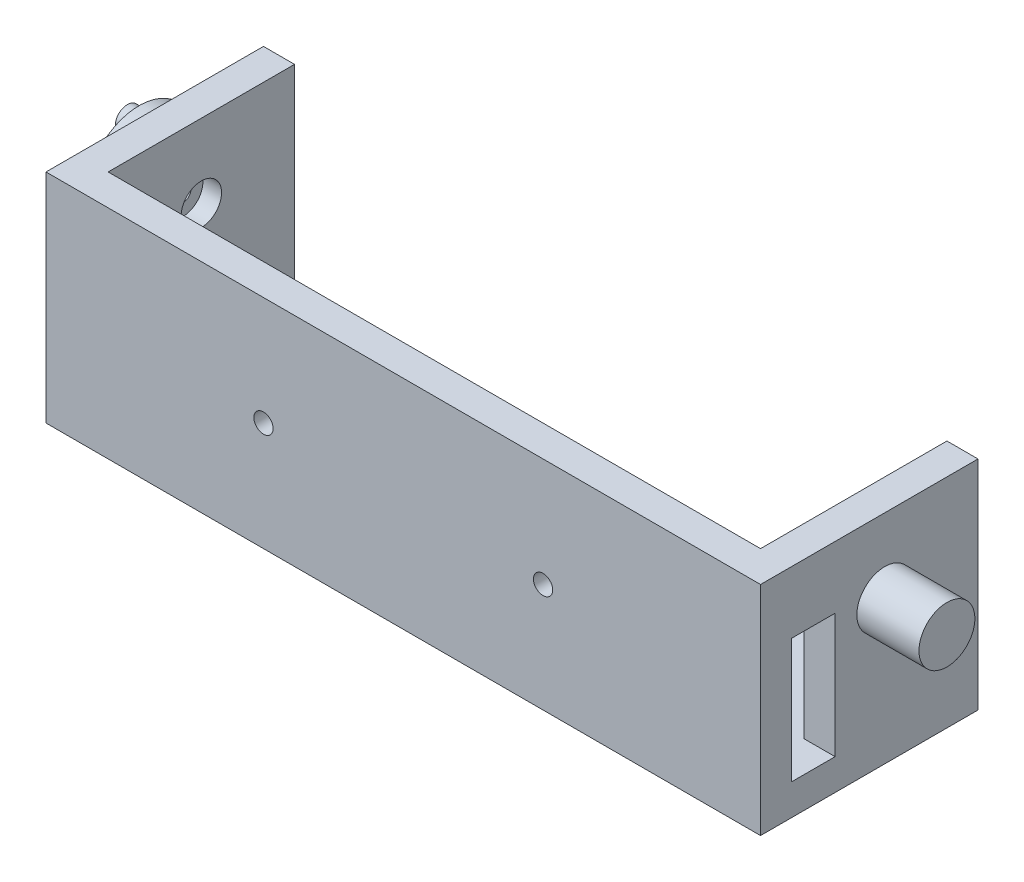
ISO-10303-21;
HEADER;
FILE_DESCRIPTION(('STEP AP214'),'2;1');
FILE_NAME('part.step','',(''),(''),'','','');
FILE_SCHEMA(('AUTOMOTIVE_DESIGN { 1 0 10303 214 1 1 1 1 }'));
ENDSEC;
DATA;
#1=APPLICATION_CONTEXT('core data for automotive mechanical design processes');
#2=APPLICATION_PROTOCOL_DEFINITION('international standard','automotive_design',2000,#1);
#3=PRODUCT_CONTEXT('',#1,'mechanical');
#4=PRODUCT('Part','Part','',(#3));
#5=PRODUCT_RELATED_PRODUCT_CATEGORY('part','',(#4));
#6=PRODUCT_DEFINITION_FORMATION('','',#4);
#7=PRODUCT_DEFINITION_CONTEXT('part definition',#1,'design');
#8=PRODUCT_DEFINITION('design','',#6,#7);
#9=PRODUCT_DEFINITION_SHAPE('','',#8);
#10=(LENGTH_UNIT() NAMED_UNIT(*) SI_UNIT(.MILLI.,.METRE.));
#11=(NAMED_UNIT(*) PLANE_ANGLE_UNIT() SI_UNIT($,.RADIAN.));
#12=(NAMED_UNIT(*) SI_UNIT($,.STERADIAN.) SOLID_ANGLE_UNIT());
#13=UNCERTAINTY_MEASURE_WITH_UNIT(LENGTH_MEASURE(1.E-05),#10,'distance_accuracy_value','');
#14=(GEOMETRIC_REPRESENTATION_CONTEXT(3) GLOBAL_UNCERTAINTY_ASSIGNED_CONTEXT((#13)) GLOBAL_UNIT_ASSIGNED_CONTEXT((#10,
#11,#12)) REPRESENTATION_CONTEXT('',''));
#15=CARTESIAN_POINT('',(0.,0.,0.));
#16=DIRECTION('',(0.,0.,1.));
#17=DIRECTION('',(1.,0.,0.));
#18=AXIS2_PLACEMENT_3D('',#15,#16,#17);
#19=CARTESIAN_POINT('',(8.81837661840736,23.,15.));
#20=DIRECTION('',(-1.,0.,0.));
#21=DIRECTION('',(0.,0.,1.));
#22=AXIS2_PLACEMENT_3D('',#19,#20,#21);
#23=CYLINDRICAL_SURFACE('',#22,1.35);
#24=CARTESIAN_POINT('',(-5.,23.,15.));
#25=DIRECTION('',(-1.,0.,0.));
#26=DIRECTION('',(0.,0.,1.));
#27=AXIS2_PLACEMENT_3D('',#24,#25,#26);
#28=CIRCLE('',#27,1.35);
#29=CARTESIAN_POINT('',(-5.,23.,16.35));
#30=VERTEX_POINT('',#29);
#31=EDGE_CURVE('E156',#30,#30,#28,.T.);
#32=ORIENTED_EDGE('',*,*,#31,.T.);
#33=EDGE_LOOP('',(#32));
#34=FACE_BOUND('',#33,.T.);
#35=CARTESIAN_POINT('',(2.,23.,15.));
#36=DIRECTION('',(1.,0.,0.));
#37=DIRECTION('',(0.,0.,-1.));
#38=AXIS2_PLACEMENT_3D('',#35,#36,#37);
#39=CIRCLE('',#38,1.35);
#40=CARTESIAN_POINT('',(2.,23.,13.65));
#41=VERTEX_POINT('',#40);
#42=EDGE_CURVE('E151',#41,#41,#39,.F.);
#43=ORIENTED_EDGE('',*,*,#42,.F.);
#44=EDGE_LOOP('',(#43));
#45=FACE_BOUND('',#44,.T.);
#46=ADVANCED_FACE('F37',(#34,#45),#23,.F.);
#47=CARTESIAN_POINT('',(0.,5.,0.));
#48=DIRECTION('',(0.,1.,0.));
#49=DIRECTION('',(0.,0.,1.));
#50=AXIS2_PLACEMENT_3D('',#47,#48,#49);
#51=PLANE('',#50);
#52=DIRECTION('',(1.,0.,0.));
#53=VECTOR('',#52,1.);
#54=CARTESIAN_POINT('',(0.,5.,30.));
#55=LINE('',#54,#53);
#56=CARTESIAN_POINT('',(5.,5.,30.));
#57=VERTEX_POINT('',#56);
#58=CARTESIAN_POINT('',(115.,5.,30.));
#59=VERTEX_POINT('',#58);
#60=EDGE_CURVE('E52',#57,#59,#55,.T.);
#61=ORIENTED_EDGE('',*,*,#60,.T.);
#62=DIRECTION('',(0.,0.,-1.));
#63=VECTOR('',#62,1.);
#64=CARTESIAN_POINT('',(115.,5.,30.));
#65=LINE('',#64,#63);
#66=CARTESIAN_POINT('',(115.,5.,23.));
#67=VERTEX_POINT('',#66);
#68=EDGE_CURVE('E132',#59,#67,#65,.T.);
#69=ORIENTED_EDGE('',*,*,#68,.T.);
#70=DIRECTION('',(1.,0.,0.));
#71=VECTOR('',#70,1.);
#72=CARTESIAN_POINT('',(88.8103798995829,5.,23.));
#73=LINE('',#72,#71);
#74=CARTESIAN_POINT('',(110.,5.,23.));
#75=VERTEX_POINT('',#74);
#76=EDGE_CURVE('E120',#75,#67,#73,.T.);
#77=ORIENTED_EDGE('',*,*,#76,.F.);
#78=DIRECTION('',(0.,0.,1.));
#79=VECTOR('',#78,1.);
#80=CARTESIAN_POINT('',(110.,5.,0.));
#81=LINE('',#80,#79);
#82=CARTESIAN_POINT('',(110.,5.,0.));
#83=VERTEX_POINT('',#82);
#84=EDGE_CURVE('E59',#83,#75,#81,.T.);
#85=ORIENTED_EDGE('',*,*,#84,.F.);
#86=DIRECTION('',(-1.,0.,0.));
#87=VECTOR('',#86,1.);
#88=CARTESIAN_POINT('',(0.,5.,0.));
#89=LINE('',#88,#87);
#90=CARTESIAN_POINT('',(5.,5.,0.));
#91=VERTEX_POINT('',#90);
#92=EDGE_CURVE('E249',#83,#91,#89,.T.);
#93=ORIENTED_EDGE('',*,*,#92,.T.);
#94=DIRECTION('',(0.,0.,-1.));
#95=VECTOR('',#94,1.);
#96=CARTESIAN_POINT('',(5.,5.,0.));
#97=LINE('',#96,#95);
#98=EDGE_CURVE('E224',#57,#91,#97,.T.);
#99=ORIENTED_EDGE('',*,*,#98,.F.);
#100=EDGE_LOOP('',(#61,#69,#77,#85,#93,#99));
#101=FACE_BOUND('',#100,.T.);
#102=ADVANCED_FACE('F133',(#101),#51,.T.);
#103=CARTESIAN_POINT('',(0.,5.,0.));
#104=DIRECTION('',(1.,0.,0.));
#105=DIRECTION('',(0.,0.,-1.));
#106=AXIS2_PLACEMENT_3D('',#103,#104,#105);
#107=PLANE('',#106);
#108=CARTESIAN_POINT('',(0.,23.,15.));
#109=DIRECTION('',(-1.,0.,0.));
#110=DIRECTION('',(0.,0.,1.));
#111=AXIS2_PLACEMENT_3D('',#108,#109,#110);
#112=CIRCLE('',#111,8.75);
#113=CARTESIAN_POINT('',(0.,23.,23.75));
#114=VERTEX_POINT('',#113);
#115=EDGE_CURVE('E45',#114,#114,#112,.T.);
#116=ORIENTED_EDGE('',*,*,#115,.F.);
#117=EDGE_LOOP('',(#116));
#118=FACE_BOUND('',#117,.T.);
#119=DIRECTION('',(0.,0.,1.));
#120=VECTOR('',#119,1.);
#121=CARTESIAN_POINT('',(0.,0.,0.));
#122=LINE('',#121,#120);
#123=CARTESIAN_POINT('',(0.,0.,0.));
#124=VERTEX_POINT('',#123);
#125=CARTESIAN_POINT('',(0.,0.,35.));
#126=VERTEX_POINT('',#125);
#127=EDGE_CURVE('E247',#124,#126,#122,.T.);
#128=ORIENTED_EDGE('',*,*,#127,.T.);
#129=DIRECTION('',(0.,-1.,0.));
#130=VECTOR('',#129,1.);
#131=CARTESIAN_POINT('',(0.,35.,35.));
#132=LINE('',#131,#130);
#133=CARTESIAN_POINT('',(0.,35.,35.));
#134=VERTEX_POINT('',#133);
#135=EDGE_CURVE('E172',#134,#126,#132,.T.);
#136=ORIENTED_EDGE('',*,*,#135,.F.);
#137=DIRECTION('',(0.,0.,1.));
#138=VECTOR('',#137,1.);
#139=CARTESIAN_POINT('',(0.,35.,0.));
#140=LINE('',#139,#138);
#141=CARTESIAN_POINT('',(0.,35.,0.));
#142=VERTEX_POINT('',#141);
#143=EDGE_CURVE('E232',#142,#134,#140,.T.);
#144=ORIENTED_EDGE('',*,*,#143,.F.);
#145=DIRECTION('',(0.,-1.,0.));
#146=VECTOR('',#145,1.);
#147=CARTESIAN_POINT('',(0.,5.,0.));
#148=LINE('',#147,#146);
#149=EDGE_CURVE('E252',#142,#124,#148,.T.);
#150=ORIENTED_EDGE('',*,*,#149,.T.);
#151=EDGE_LOOP('',(#128,#136,#144,#150));
#152=FACE_BOUND('',#151,.T.);
#153=ADVANCED_FACE('F39',(#118,#152),#107,.F.);
#154=CARTESIAN_POINT('',(115.,5.,0.));
#155=DIRECTION('',(-1.,0.,0.));
#156=DIRECTION('',(0.,0.,1.));
#157=AXIS2_PLACEMENT_3D('',#154,#155,#156);
#158=PLANE('',#157);
#159=CARTESIAN_POINT('',(115.,23.,15.));
#160=DIRECTION('',(-1.,0.,0.));
#161=DIRECTION('',(0.,0.,1.));
#162=AXIS2_PLACEMENT_3D('',#159,#160,#161);
#163=CIRCLE('',#162,4.5);
#164=CARTESIAN_POINT('',(115.,23.,19.5));
#165=VERTEX_POINT('',#164);
#166=EDGE_CURVE('E11',#165,#165,#163,.F.);
#167=ORIENTED_EDGE('',*,*,#166,.F.);
#168=EDGE_LOOP('',(#167));
#169=FACE_BOUND('',#168,.T.);
#170=ORIENTED_EDGE('',*,*,#68,.F.);
#171=DIRECTION('',(0.,-1.,0.));
#172=VECTOR('',#171,1.);
#173=CARTESIAN_POINT('',(115.,25.,30.));
#174=LINE('',#173,#172);
#175=CARTESIAN_POINT('',(115.,25.,30.));
#176=VERTEX_POINT('',#175);
#177=EDGE_CURVE('E136',#176,#59,#174,.T.);
#178=ORIENTED_EDGE('',*,*,#177,.F.);
#179=DIRECTION('',(0.,0.,1.));
#180=VECTOR('',#179,1.);
#181=CARTESIAN_POINT('',(115.,25.,30.));
#182=LINE('',#181,#180);
#183=CARTESIAN_POINT('',(115.,25.,23.));
#184=VERTEX_POINT('',#183);
#185=EDGE_CURVE('E129',#184,#176,#182,.T.);
#186=ORIENTED_EDGE('',*,*,#185,.F.);
#187=DIRECTION('',(0.,1.,0.));
#188=VECTOR('',#187,1.);
#189=CARTESIAN_POINT('',(115.,25.,23.));
#190=LINE('',#189,#188);
#191=EDGE_CURVE('E124',#67,#184,#190,.T.);
#192=ORIENTED_EDGE('',*,*,#191,.F.);
#193=EDGE_LOOP('',(#170,#178,#186,#192));
#194=FACE_BOUND('',#193,.T.);
#195=DIRECTION('',(0.,0.,-1.));
#196=VECTOR('',#195,1.);
#197=CARTESIAN_POINT('',(115.,0.,0.));
#198=LINE('',#197,#196);
#199=CARTESIAN_POINT('',(115.,0.,35.));
#200=VERTEX_POINT('',#199);
#201=CARTESIAN_POINT('',(115.,0.,0.));
#202=VERTEX_POINT('',#201);
#203=EDGE_CURVE('E254',#200,#202,#198,.T.);
#204=ORIENTED_EDGE('',*,*,#203,.T.);
#205=DIRECTION('',(0.,-1.,0.));
#206=VECTOR('',#205,1.);
#207=CARTESIAN_POINT('',(115.,5.,0.));
#208=LINE('',#207,#206);
#209=CARTESIAN_POINT('',(115.,35.,0.));
#210=VERTEX_POINT('',#209);
#211=EDGE_CURVE('E216',#210,#202,#208,.T.);
#212=ORIENTED_EDGE('',*,*,#211,.F.);
#213=DIRECTION('',(0.,0.,-1.));
#214=VECTOR('',#213,1.);
#215=CARTESIAN_POINT('',(115.,35.,0.));
#216=LINE('',#215,#214);
#217=CARTESIAN_POINT('',(115.,35.,35.));
#218=VERTEX_POINT('',#217);
#219=EDGE_CURVE('E225',#218,#210,#216,.T.);
#220=ORIENTED_EDGE('',*,*,#219,.F.);
#221=DIRECTION('',(0.,1.,0.));
#222=VECTOR('',#221,1.);
#223=CARTESIAN_POINT('',(115.,35.,35.));
#224=LINE('',#223,#222);
#225=EDGE_CURVE('E178',#200,#218,#224,.T.);
#226=ORIENTED_EDGE('',*,*,#225,.F.);
#227=EDGE_LOOP('',(#204,#212,#220,#226));
#228=FACE_BOUND('',#227,.T.);
#229=ADVANCED_FACE('F138',(#169,#194,#228),#158,.F.);
#230=CARTESIAN_POINT('',(0.,5.,0.));
#231=DIRECTION('',(0.,0.,1.));
#232=DIRECTION('',(1.,0.,0.));
#233=AXIS2_PLACEMENT_3D('',#230,#231,#232);
#234=PLANE('',#233);
#235=DIRECTION('',(-1.,0.,0.));
#236=VECTOR('',#235,1.);
#237=CARTESIAN_POINT('',(0.,0.,0.));
#238=LINE('',#237,#236);
#239=EDGE_CURVE('E250',#202,#124,#238,.T.);
#240=ORIENTED_EDGE('',*,*,#239,.T.);
#241=ORIENTED_EDGE('',*,*,#149,.F.);
#242=DIRECTION('',(-1.,0.,0.));
#243=VECTOR('',#242,1.);
#244=CARTESIAN_POINT('',(0.,35.,0.));
#245=LINE('',#244,#243);
#246=CARTESIAN_POINT('',(5.,35.,0.));
#247=VERTEX_POINT('',#246);
#248=EDGE_CURVE('E236',#247,#142,#245,.T.);
#249=ORIENTED_EDGE('',*,*,#248,.F.);
#250=DIRECTION('',(0.,-1.,0.));
#251=VECTOR('',#250,1.);
#252=CARTESIAN_POINT('',(5.,35.,0.));
#253=LINE('',#252,#251);
#254=EDGE_CURVE('E239',#247,#91,#253,.T.);
#255=ORIENTED_EDGE('',*,*,#254,.T.);
#256=ORIENTED_EDGE('',*,*,#92,.F.);
#257=DIRECTION('',(0.,-1.,0.));
#258=VECTOR('',#257,1.);
#259=CARTESIAN_POINT('',(110.,35.,0.));
#260=LINE('',#259,#258);
#261=CARTESIAN_POINT('',(110.,35.,0.));
#262=VERTEX_POINT('',#261);
#263=EDGE_CURVE('E213',#262,#83,#260,.T.);
#264=ORIENTED_EDGE('',*,*,#263,.F.);
#265=DIRECTION('',(-1.,0.,0.));
#266=VECTOR('',#265,1.);
#267=CARTESIAN_POINT('',(115.,35.,0.));
#268=LINE('',#267,#266);
#269=EDGE_CURVE('E228',#210,#262,#268,.T.);
#270=ORIENTED_EDGE('',*,*,#269,.F.);
#271=ORIENTED_EDGE('',*,*,#211,.T.);
#272=EDGE_LOOP('',(#240,#241,#249,#255,#256,#264,#270,#271));
#273=FACE_BOUND('',#272,.T.);
#274=ADVANCED_FACE('F347',(#273),#234,.F.);
#275=CARTESIAN_POINT('',(0.,0.,0.));
#276=DIRECTION('',(0.,1.,0.));
#277=DIRECTION('',(0.,0.,1.));
#278=AXIS2_PLACEMENT_3D('',#275,#276,#277);
#279=PLANE('',#278);
#280=ORIENTED_EDGE('',*,*,#127,.F.);
#281=ORIENTED_EDGE('',*,*,#239,.F.);
#282=ORIENTED_EDGE('',*,*,#203,.F.);
#283=DIRECTION('',(1.,0.,0.));
#284=VECTOR('',#283,1.);
#285=CARTESIAN_POINT('',(0.,0.,35.));
#286=LINE('',#285,#284);
#287=EDGE_CURVE('E175',#126,#200,#286,.T.);
#288=ORIENTED_EDGE('',*,*,#287,.F.);
#289=EDGE_LOOP('',(#280,#281,#282,#288));
#290=FACE_BOUND('',#289,.T.);
#291=ADVANCED_FACE('F342',(#290),#279,.F.);
#292=CARTESIAN_POINT('',(5.,35.,0.));
#293=DIRECTION('',(-1.,0.,0.));
#294=DIRECTION('',(0.,0.,1.));
#295=AXIS2_PLACEMENT_3D('',#292,#293,#294);
#296=PLANE('',#295);
#297=CARTESIAN_POINT('',(5.,23.,15.));
#298=DIRECTION('',(1.,0.,0.));
#299=DIRECTION('',(0.,0.,-1.));
#300=AXIS2_PLACEMENT_3D('',#297,#298,#299);
#301=CIRCLE('',#300,3.25);
#302=CARTESIAN_POINT('',(5.,23.,11.75));
#303=VERTEX_POINT('',#302);
#304=EDGE_CURVE('E152',#303,#303,#301,.T.);
#305=ORIENTED_EDGE('',*,*,#304,.F.);
#306=EDGE_LOOP('',(#305));
#307=FACE_BOUND('',#306,.T.);
#308=ORIENTED_EDGE('',*,*,#98,.T.);
#309=ORIENTED_EDGE('',*,*,#254,.F.);
#310=DIRECTION('',(0.,0.,-1.));
#311=VECTOR('',#310,1.);
#312=CARTESIAN_POINT('',(5.,35.,0.));
#313=LINE('',#312,#311);
#314=CARTESIAN_POINT('',(5.,35.,30.));
#315=VERTEX_POINT('',#314);
#316=EDGE_CURVE('E234',#315,#247,#313,.T.);
#317=ORIENTED_EDGE('',*,*,#316,.F.);
#318=DIRECTION('',(0.,-1.,0.));
#319=VECTOR('',#318,1.);
#320=CARTESIAN_POINT('',(5.,35.,30.));
#321=LINE('',#320,#319);
#322=EDGE_CURVE('E244',#315,#57,#321,.T.);
#323=ORIENTED_EDGE('',*,*,#322,.T.);
#324=EDGE_LOOP('',(#308,#309,#317,#323));
#325=FACE_BOUND('',#324,.T.);
#326=ADVANCED_FACE('F339',(#307,#325),#296,.F.);
#327=CARTESIAN_POINT('',(0.,35.,0.));
#328=DIRECTION('',(0.,1.,0.));
#329=DIRECTION('',(0.,0.,1.));
#330=AXIS2_PLACEMENT_3D('',#327,#328,#329);
#331=PLANE('',#330);
#332=ORIENTED_EDGE('',*,*,#143,.T.);
#333=DIRECTION('',(-1.,0.,0.));
#334=VECTOR('',#333,1.);
#335=CARTESIAN_POINT('',(0.,35.,35.));
#336=LINE('',#335,#334);
#337=EDGE_CURVE('E181',#218,#134,#336,.T.);
#338=ORIENTED_EDGE('',*,*,#337,.F.);
#339=ORIENTED_EDGE('',*,*,#219,.T.);
#340=ORIENTED_EDGE('',*,*,#269,.T.);
#341=DIRECTION('',(0.,0.,1.));
#342=VECTOR('',#341,1.);
#343=CARTESIAN_POINT('',(110.,35.,0.));
#344=LINE('',#343,#342);
#345=CARTESIAN_POINT('',(110.,35.,30.));
#346=VERTEX_POINT('',#345);
#347=EDGE_CURVE('E222',#262,#346,#344,.T.);
#348=ORIENTED_EDGE('',*,*,#347,.T.);
#349=DIRECTION('',(-1.,0.,0.));
#350=VECTOR('',#349,1.);
#351=CARTESIAN_POINT('',(0.,35.,30.));
#352=LINE('',#351,#350);
#353=EDGE_CURVE('E163',#346,#315,#352,.T.);
#354=ORIENTED_EDGE('',*,*,#353,.T.);
#355=ORIENTED_EDGE('',*,*,#316,.T.);
#356=ORIENTED_EDGE('',*,*,#248,.T.);
#357=EDGE_LOOP('',(#332,#338,#339,#340,#348,#354,#355,#356));
#358=FACE_BOUND('',#357,.T.);
#359=ADVANCED_FACE('F335',(#358),#331,.T.);
#360=CARTESIAN_POINT('',(110.,35.,0.));
#361=DIRECTION('',(1.,0.,0.));
#362=DIRECTION('',(0.,0.,-1.));
#363=AXIS2_PLACEMENT_3D('',#360,#361,#362);
#364=PLANE('',#363);
#365=DIRECTION('',(0.,-1.,0.));
#366=VECTOR('',#365,1.);
#367=CARTESIAN_POINT('',(110.,25.,23.));
#368=LINE('',#367,#366);
#369=CARTESIAN_POINT('',(110.,25.,23.));
#370=VERTEX_POINT('',#369);
#371=EDGE_CURVE('E127',#370,#75,#368,.T.);
#372=ORIENTED_EDGE('',*,*,#371,.F.);
#373=DIRECTION('',(0.,0.,-1.));
#374=VECTOR('',#373,1.);
#375=CARTESIAN_POINT('',(110.,25.,30.));
#376=LINE('',#375,#374);
#377=CARTESIAN_POINT('',(110.,25.,30.));
#378=VERTEX_POINT('',#377);
#379=EDGE_CURVE('E155',#378,#370,#376,.T.);
#380=ORIENTED_EDGE('',*,*,#379,.F.);
#381=DIRECTION('',(0.,-1.,0.));
#382=VECTOR('',#381,1.);
#383=CARTESIAN_POINT('',(110.,35.,30.));
#384=LINE('',#383,#382);
#385=EDGE_CURVE('E219',#346,#378,#384,.T.);
#386=ORIENTED_EDGE('',*,*,#385,.F.);
#387=ORIENTED_EDGE('',*,*,#347,.F.);
#388=ORIENTED_EDGE('',*,*,#263,.T.);
#389=ORIENTED_EDGE('',*,*,#84,.T.);
#390=EDGE_LOOP('',(#372,#380,#386,#387,#388,#389));
#391=FACE_BOUND('',#390,.T.);
#392=ADVANCED_FACE('F331',(#391),#364,.F.);
#393=CARTESIAN_POINT('',(-5.,23.,15.));
#394=DIRECTION('',(1.,0.,0.));
#395=DIRECTION('',(0.,0.,-1.));
#396=AXIS2_PLACEMENT_3D('',#393,#394,#395);
#397=CYLINDRICAL_SURFACE('',#396,8.75);
#398=CARTESIAN_POINT('',(-5.,23.,15.));
#399=DIRECTION('',(-1.,0.,0.));
#400=DIRECTION('',(0.,0.,1.));
#401=AXIS2_PLACEMENT_3D('',#398,#399,#400);
#402=CIRCLE('',#401,8.75);
#403=CARTESIAN_POINT('',(-5.,23.,23.75));
#404=VERTEX_POINT('',#403);
#405=EDGE_CURVE('E208',#404,#404,#402,.T.);
#406=ORIENTED_EDGE('',*,*,#405,.F.);
#407=EDGE_LOOP('',(#406));
#408=FACE_BOUND('',#407,.T.);
#409=ORIENTED_EDGE('',*,*,#115,.T.);
#410=EDGE_LOOP('',(#409));
#411=FACE_BOUND('',#410,.T.);
#412=ADVANCED_FACE('F327',(#408,#411),#397,.T.);
#413=CARTESIAN_POINT('',(-5.,23.,15.));
#414=DIRECTION('',(-1.,0.,0.));
#415=DIRECTION('',(0.,0.,1.));
#416=AXIS2_PLACEMENT_3D('',#413,#414,#415);
#417=PLANE('',#416);
#418=ORIENTED_EDGE('',*,*,#31,.F.);
#419=EDGE_LOOP('',(#418));
#420=FACE_BOUND('',#419,.T.);
#421=CARTESIAN_POINT('',(-5.,23.0000000000001,21.));
#422=DIRECTION('',(-1.,0.,0.));
#423=DIRECTION('',(0.,-1.,0.));
#424=AXIS2_PLACEMENT_3D('',#421,#422,#423);
#425=CIRCLE('',#424,1.95);
#426=CARTESIAN_POINT('',(-5.,23.0000000000001,19.05));
#427=VERTEX_POINT('',#426);
#428=EDGE_CURVE('E184',#427,#427,#425,.T.);
#429=ORIENTED_EDGE('',*,*,#428,.F.);
#430=EDGE_LOOP('',(#429));
#431=FACE_BOUND('',#430,.T.);
#432=CARTESIAN_POINT('',(-5.,17.,15.));
#433=DIRECTION('',(-1.,0.,0.));
#434=DIRECTION('',(0.,0.,-1.));
#435=AXIS2_PLACEMENT_3D('',#432,#433,#434);
#436=CIRCLE('',#435,1.95);
#437=CARTESIAN_POINT('',(-5.,17.,13.05));
#438=VERTEX_POINT('',#437);
#439=EDGE_CURVE('E190',#438,#438,#436,.T.);
#440=ORIENTED_EDGE('',*,*,#439,.F.);
#441=EDGE_LOOP('',(#440));
#442=FACE_BOUND('',#441,.T.);
#443=CARTESIAN_POINT('',(-5.,23.,9.));
#444=DIRECTION('',(-1.,0.,0.));
#445=DIRECTION('',(0.,1.,0.));
#446=AXIS2_PLACEMENT_3D('',#443,#444,#445);
#447=CIRCLE('',#446,1.95);
#448=CARTESIAN_POINT('',(-5.,23.,7.05));
#449=VERTEX_POINT('',#448);
#450=EDGE_CURVE('E196',#449,#449,#447,.T.);
#451=ORIENTED_EDGE('',*,*,#450,.F.);
#452=EDGE_LOOP('',(#451));
#453=FACE_BOUND('',#452,.T.);
#454=CARTESIAN_POINT('',(-5.,29.,15.));
#455=DIRECTION('',(-1.,0.,0.));
#456=DIRECTION('',(0.,0.,1.));
#457=AXIS2_PLACEMENT_3D('',#454,#455,#456);
#458=CIRCLE('',#457,1.95);
#459=CARTESIAN_POINT('',(-5.,29.,13.05));
#460=VERTEX_POINT('',#459);
#461=EDGE_CURVE('E202',#460,#460,#458,.T.);
#462=ORIENTED_EDGE('',*,*,#461,.F.);
#463=EDGE_LOOP('',(#462));
#464=FACE_BOUND('',#463,.T.);
#465=ORIENTED_EDGE('',*,*,#405,.T.);
#466=EDGE_LOOP('',(#465));
#467=FACE_BOUND('',#466,.T.);
#468=ADVANCED_FACE('F323',(#420,#431,#442,#453,#464,#467),#417,.T.);
#469=CARTESIAN_POINT('',(-6.9,29.,15.));
#470=DIRECTION('',(1.,0.,0.));
#471=DIRECTION('',(0.,0.,-1.));
#472=AXIS2_PLACEMENT_3D('',#469,#470,#471);
#473=CYLINDRICAL_SURFACE('',#472,1.95);
#474=CARTESIAN_POINT('',(-6.9,29.,15.));
#475=DIRECTION('',(-1.,0.,0.));
#476=DIRECTION('',(0.,0.,1.));
#477=AXIS2_PLACEMENT_3D('',#474,#475,#476);
#478=CIRCLE('',#477,1.95);
#479=CARTESIAN_POINT('',(-6.9,29.,13.05));
#480=VERTEX_POINT('',#479);
#481=EDGE_CURVE('E205',#480,#480,#478,.T.);
#482=CARTESIAN_POINT('',(-6.9,29.,13.05));
#483=CARTESIAN_POINT('',(-6.88020833333333,29.,13.05));
#484=CARTESIAN_POINT('',(-6.86041666666666,29.,13.05));
#485=CARTESIAN_POINT('',(-6.82083333333333,29.,13.05));
#486=CARTESIAN_POINT('',(-6.80104166666667,29.,13.05));
#487=CARTESIAN_POINT('',(-6.76145833333333,29.,13.05));
#488=CARTESIAN_POINT('',(-6.74166666666666,29.,13.05));
#489=CARTESIAN_POINT('',(-6.70208333333333,29.,13.05));
#490=CARTESIAN_POINT('',(-6.68229166666667,29.,13.05));
#491=CARTESIAN_POINT('',(-6.64270833333333,29.,13.05));
#492=CARTESIAN_POINT('',(-6.62291666666667,29.,13.05));
#493=CARTESIAN_POINT('',(-6.58333333333333,29.,13.05));
#494=CARTESIAN_POINT('',(-6.56354166666667,29.,13.05));
#495=CARTESIAN_POINT('',(-6.52395833333333,29.,13.05));
#496=CARTESIAN_POINT('',(-6.50416666666666,29.,13.05));
#497=CARTESIAN_POINT('',(-6.46458333333333,29.,13.05));
#498=CARTESIAN_POINT('',(-6.44479166666667,29.,13.05));
#499=CARTESIAN_POINT('',(-6.40520833333333,29.,13.05));
#500=CARTESIAN_POINT('',(-6.38541666666667,29.,13.05));
#501=CARTESIAN_POINT('',(-6.34583333333333,29.,13.05));
#502=CARTESIAN_POINT('',(-6.32604166666667,29.,13.05));
#503=CARTESIAN_POINT('',(-6.28645833333333,29.,13.05));
#504=CARTESIAN_POINT('',(-6.26666666666666,29.,13.05));
#505=CARTESIAN_POINT('',(-6.22708333333333,29.,13.05));
#506=CARTESIAN_POINT('',(-6.20729166666667,29.,13.05));
#507=CARTESIAN_POINT('',(-6.16770833333333,29.,13.05));
#508=CARTESIAN_POINT('',(-6.14791666666667,29.,13.05));
#509=CARTESIAN_POINT('',(-6.10833333333333,29.,13.05));
#510=CARTESIAN_POINT('',(-6.08854166666667,29.,13.05));
#511=CARTESIAN_POINT('',(-6.04895833333333,29.,13.05));
#512=CARTESIAN_POINT('',(-6.02916666666667,29.,13.05));
#513=CARTESIAN_POINT('',(-5.98958333333333,29.,13.05));
#514=CARTESIAN_POINT('',(-5.96979166666666,29.,13.05));
#515=CARTESIAN_POINT('',(-5.93020833333333,29.,13.05));
#516=CARTESIAN_POINT('',(-5.91041666666667,29.,13.05));
#517=CARTESIAN_POINT('',(-5.87083333333333,29.,13.05));
#518=CARTESIAN_POINT('',(-5.85104166666667,29.,13.05));
#519=CARTESIAN_POINT('',(-5.81145833333333,29.,13.05));
#520=CARTESIAN_POINT('',(-5.79166666666667,29.,13.05));
#521=CARTESIAN_POINT('',(-5.75208333333333,29.,13.05));
#522=CARTESIAN_POINT('',(-5.73229166666667,29.,13.05));
#523=CARTESIAN_POINT('',(-5.69270833333333,29.,13.05));
#524=CARTESIAN_POINT('',(-5.67291666666667,29.,13.05));
#525=CARTESIAN_POINT('',(-5.63333333333333,29.,13.05));
#526=CARTESIAN_POINT('',(-5.61354166666667,29.,13.05));
#527=CARTESIAN_POINT('',(-5.57395833333333,29.,13.05));
#528=CARTESIAN_POINT('',(-5.55416666666667,29.,13.05));
#529=CARTESIAN_POINT('',(-5.51458333333333,29.,13.05));
#530=CARTESIAN_POINT('',(-5.49479166666667,29.,13.05));
#531=CARTESIAN_POINT('',(-5.45520833333333,29.,13.05));
#532=CARTESIAN_POINT('',(-5.43541666666667,29.,13.05));
#533=CARTESIAN_POINT('',(-5.39583333333333,29.,13.05));
#534=CARTESIAN_POINT('',(-5.37604166666666,29.,13.05));
#535=CARTESIAN_POINT('',(-5.33645833333333,29.,13.05));
#536=CARTESIAN_POINT('',(-5.31666666666666,29.,13.05));
#537=CARTESIAN_POINT('',(-5.27708333333333,29.,13.05));
#538=CARTESIAN_POINT('',(-5.25729166666667,29.,13.05));
#539=CARTESIAN_POINT('',(-5.21770833333333,29.,13.05));
#540=CARTESIAN_POINT('',(-5.19791666666667,29.,13.05));
#541=CARTESIAN_POINT('',(-5.15833333333333,29.,13.05));
#542=CARTESIAN_POINT('',(-5.13854166666667,29.,13.05));
#543=CARTESIAN_POINT('',(-5.09895833333333,29.,13.05));
#544=CARTESIAN_POINT('',(-5.07916666666666,29.,13.05));
#545=CARTESIAN_POINT('',(-5.03958333333333,29.,13.05));
#546=CARTESIAN_POINT('',(-5.01979166666667,29.,13.05));
#547=CARTESIAN_POINT('',(-5.,29.,13.05));
#548=B_SPLINE_CURVE_WITH_KNOTS('',3,(#482,#483,#484,#485,#486,#487,#488,#489,#490,#491,#492,
#493,#494,#495,#496,#497,#498,#499,#500,#501,#502,#503,#504,#505,#506,#507,#508,#509,#510,#511,
#512,#513,#514,#515,#516,#517,#518,#519,#520,#521,#522,#523,#524,#525,#526,#527,#528,#529,#530,
#531,#532,#533,#534,#535,#536,#537,#538,#539,#540,#541,#542,#543,#544,#545,#546,#547),
.UNSPECIFIED.,.F.,.F.,(4,2,2,2,2,2,2,2,2,2,2,2,2,2,2,2,2,2,2,2,2,2,2,2,2,2,2,2,2,2,2,2,4),(0.,
0.0593749999999995,0.11875,0.178124999999999,0.2375,0.296874999999999,0.35625,0.415624999999999,
0.475,0.534374999999999,0.59375,0.653124999999999,0.7125,0.771875,0.831249999999999,0.890625,
0.95,1.009375,1.06875,1.128125,1.1875,1.246875,1.30625,1.365625,1.425,1.484375,1.54375,1.603125,
1.6625,1.721875,1.78125,1.840625,1.9),.UNSPECIFIED.);
#549=EDGE_CURVE('BSEAM319',#480,#460,#548,.T.);
#550=ORIENTED_EDGE('',*,*,#481,.F.);
#551=ORIENTED_EDGE('',*,*,#461,.T.);
#552=ORIENTED_EDGE('',*,*,#549,.T.);
#553=ORIENTED_EDGE('',*,*,#549,.F.);
#554=EDGE_LOOP('',(#550,#552,#551,#553));
#555=FACE_BOUND('',#554,.T.);
#556=ADVANCED_FACE('F319',(#555),#473,.T.);
#557=CARTESIAN_POINT('',(-6.9,29.,15.));
#558=DIRECTION('',(-1.,0.,0.));
#559=DIRECTION('',(0.,0.,1.));
#560=AXIS2_PLACEMENT_3D('',#557,#558,#559);
#561=PLANE('',#560);
#562=ORIENTED_EDGE('',*,*,#481,.T.);
#563=EDGE_LOOP('',(#562));
#564=FACE_BOUND('',#563,.T.);
#565=ADVANCED_FACE('F315',(#564),#561,.T.);
#566=CARTESIAN_POINT('',(-6.9,23.,9.));
#567=DIRECTION('',(1.,0.,0.));
#568=DIRECTION('',(0.,0.,-1.));
#569=AXIS2_PLACEMENT_3D('',#566,#567,#568);
#570=CYLINDRICAL_SURFACE('',#569,1.95);
#571=CARTESIAN_POINT('',(-6.9,23.,9.));
#572=DIRECTION('',(-1.,0.,0.));
#573=DIRECTION('',(0.,1.,0.));
#574=AXIS2_PLACEMENT_3D('',#571,#572,#573);
#575=CIRCLE('',#574,1.95);
#576=CARTESIAN_POINT('',(-6.9,23.,7.05));
#577=VERTEX_POINT('',#576);
#578=EDGE_CURVE('E199',#577,#577,#575,.T.);
#579=CARTESIAN_POINT('',(-6.9,23.,7.05));
#580=CARTESIAN_POINT('',(-6.88020833333333,23.,7.05));
#581=CARTESIAN_POINT('',(-6.86041666666667,23.,7.05));
#582=CARTESIAN_POINT('',(-6.82083333333333,23.,7.05));
#583=CARTESIAN_POINT('',(-6.80104166666667,23.,7.05));
#584=CARTESIAN_POINT('',(-6.76145833333333,23.,7.05));
#585=CARTESIAN_POINT('',(-6.74166666666667,23.,7.05));
#586=CARTESIAN_POINT('',(-6.70208333333333,23.,7.05));
#587=CARTESIAN_POINT('',(-6.68229166666667,23.,7.05));
#588=CARTESIAN_POINT('',(-6.64270833333333,23.,7.05));
#589=CARTESIAN_POINT('',(-6.62291666666667,23.,7.05));
#590=CARTESIAN_POINT('',(-6.58333333333333,23.,7.05));
#591=CARTESIAN_POINT('',(-6.56354166666667,23.,7.05));
#592=CARTESIAN_POINT('',(-6.52395833333333,23.,7.05));
#593=CARTESIAN_POINT('',(-6.50416666666667,23.,7.05));
#594=CARTESIAN_POINT('',(-6.46458333333333,23.,7.05));
#595=CARTESIAN_POINT('',(-6.44479166666667,23.,7.05));
#596=CARTESIAN_POINT('',(-6.40520833333333,23.,7.05));
#597=CARTESIAN_POINT('',(-6.38541666666667,23.,7.05));
#598=CARTESIAN_POINT('',(-6.34583333333333,23.,7.05));
#599=CARTESIAN_POINT('',(-6.32604166666667,23.,7.05));
#600=CARTESIAN_POINT('',(-6.28645833333333,23.,7.05));
#601=CARTESIAN_POINT('',(-6.26666666666667,23.,7.05));
#602=CARTESIAN_POINT('',(-6.22708333333333,23.,7.05));
#603=CARTESIAN_POINT('',(-6.20729166666667,23.,7.05));
#604=CARTESIAN_POINT('',(-6.16770833333333,23.,7.05));
#605=CARTESIAN_POINT('',(-6.14791666666667,23.,7.05));
#606=CARTESIAN_POINT('',(-6.10833333333333,23.,7.05));
#607=CARTESIAN_POINT('',(-6.08854166666667,23.,7.05));
#608=CARTESIAN_POINT('',(-6.04895833333333,23.,7.05));
#609=CARTESIAN_POINT('',(-6.02916666666667,23.,7.05));
#610=CARTESIAN_POINT('',(-5.98958333333333,23.,7.05));
#611=CARTESIAN_POINT('',(-5.96979166666667,23.,7.05));
#612=CARTESIAN_POINT('',(-5.93020833333333,23.,7.05));
#613=CARTESIAN_POINT('',(-5.91041666666667,23.,7.05));
#614=CARTESIAN_POINT('',(-5.87083333333333,23.,7.05));
#615=CARTESIAN_POINT('',(-5.85104166666667,23.,7.05));
#616=CARTESIAN_POINT('',(-5.81145833333333,23.,7.05));
#617=CARTESIAN_POINT('',(-5.79166666666667,23.,7.05));
#618=CARTESIAN_POINT('',(-5.75208333333333,23.,7.05));
#619=CARTESIAN_POINT('',(-5.73229166666667,23.,7.05));
#620=CARTESIAN_POINT('',(-5.69270833333333,23.,7.05));
#621=CARTESIAN_POINT('',(-5.67291666666667,23.,7.05));
#622=CARTESIAN_POINT('',(-5.63333333333333,23.,7.05));
#623=CARTESIAN_POINT('',(-5.61354166666667,23.,7.05));
#624=CARTESIAN_POINT('',(-5.57395833333333,23.,7.05));
#625=CARTESIAN_POINT('',(-5.55416666666667,23.,7.05));
#626=CARTESIAN_POINT('',(-5.51458333333333,23.,7.05));
#627=CARTESIAN_POINT('',(-5.49479166666667,23.,7.05));
#628=CARTESIAN_POINT('',(-5.45520833333333,23.,7.05));
#629=CARTESIAN_POINT('',(-5.43541666666667,23.,7.05));
#630=CARTESIAN_POINT('',(-5.39583333333333,23.,7.05));
#631=CARTESIAN_POINT('',(-5.37604166666667,23.,7.05));
#632=CARTESIAN_POINT('',(-5.33645833333333,23.,7.05));
#633=CARTESIAN_POINT('',(-5.31666666666667,23.,7.05));
#634=CARTESIAN_POINT('',(-5.27708333333333,23.,7.05));
#635=CARTESIAN_POINT('',(-5.25729166666667,23.,7.05));
#636=CARTESIAN_POINT('',(-5.21770833333333,23.,7.05));
#637=CARTESIAN_POINT('',(-5.19791666666667,23.,7.05));
#638=CARTESIAN_POINT('',(-5.15833333333333,23.,7.05));
#639=CARTESIAN_POINT('',(-5.13854166666667,23.,7.05));
#640=CARTESIAN_POINT('',(-5.09895833333333,23.,7.05));
#641=CARTESIAN_POINT('',(-5.07916666666667,23.,7.05));
#642=CARTESIAN_POINT('',(-5.03958333333333,23.,7.05));
#643=CARTESIAN_POINT('',(-5.01979166666667,23.,7.05));
#644=CARTESIAN_POINT('',(-5.,23.,7.05));
#645=B_SPLINE_CURVE_WITH_KNOTS('',3,(#579,#580,#581,#582,#583,#584,#585,#586,#587,#588,#589,
#590,#591,#592,#593,#594,#595,#596,#597,#598,#599,#600,#601,#602,#603,#604,#605,#606,#607,#608,
#609,#610,#611,#612,#613,#614,#615,#616,#617,#618,#619,#620,#621,#622,#623,#624,#625,#626,#627,
#628,#629,#630,#631,#632,#633,#634,#635,#636,#637,#638,#639,#640,#641,#642,#643,#644),
.UNSPECIFIED.,.F.,.F.,(4,2,2,2,2,2,2,2,2,2,2,2,2,2,2,2,2,2,2,2,2,2,2,2,2,2,2,2,2,2,2,2,4),(0.,
0.0593749999999995,0.11875,0.178124999999999,0.2375,0.296874999999999,0.35625,0.415624999999999,
0.475,0.534374999999999,0.59375,0.653124999999999,0.7125,0.771874999999999,0.831249999999999,
0.890624999999999,0.95,1.009375,1.06875,1.128125,1.1875,1.246875,1.30625,1.365625,1.425,
1.484375,1.54375,1.603125,1.6625,1.721875,1.78125,1.840625,1.9),.UNSPECIFIED.);
#646=EDGE_CURVE('BSEAM311',#577,#449,#645,.T.);
#647=ORIENTED_EDGE('',*,*,#578,.F.);
#648=ORIENTED_EDGE('',*,*,#450,.T.);
#649=ORIENTED_EDGE('',*,*,#646,.T.);
#650=ORIENTED_EDGE('',*,*,#646,.F.);
#651=EDGE_LOOP('',(#647,#649,#648,#650));
#652=FACE_BOUND('',#651,.T.);
#653=ADVANCED_FACE('F311',(#652),#570,.T.);
#654=CARTESIAN_POINT('',(-6.9,23.,9.));
#655=DIRECTION('',(-1.,0.,0.));
#656=DIRECTION('',(0.,1.,0.));
#657=AXIS2_PLACEMENT_3D('',#654,#655,#656);
#658=PLANE('',#657);
#659=ORIENTED_EDGE('',*,*,#578,.T.);
#660=EDGE_LOOP('',(#659));
#661=FACE_BOUND('',#660,.T.);
#662=ADVANCED_FACE('F307',(#661),#658,.T.);
#663=CARTESIAN_POINT('',(-6.9,17.,15.));
#664=DIRECTION('',(1.,0.,0.));
#665=DIRECTION('',(0.,0.,-1.));
#666=AXIS2_PLACEMENT_3D('',#663,#664,#665);
#667=CYLINDRICAL_SURFACE('',#666,1.95);
#668=CARTESIAN_POINT('',(-6.9,17.,15.));
#669=DIRECTION('',(-1.,0.,0.));
#670=DIRECTION('',(0.,0.,-1.));
#671=AXIS2_PLACEMENT_3D('',#668,#669,#670);
#672=CIRCLE('',#671,1.95);
#673=CARTESIAN_POINT('',(-6.9,17.,13.05));
#674=VERTEX_POINT('',#673);
#675=EDGE_CURVE('E193',#674,#674,#672,.T.);
#676=CARTESIAN_POINT('',(-6.9,17.,13.05));
#677=CARTESIAN_POINT('',(-6.88020833333333,17.,13.05));
#678=CARTESIAN_POINT('',(-6.86041666666666,17.,13.05));
#679=CARTESIAN_POINT('',(-6.82083333333333,17.,13.05));
#680=CARTESIAN_POINT('',(-6.80104166666667,17.,13.05));
#681=CARTESIAN_POINT('',(-6.76145833333333,17.,13.05));
#682=CARTESIAN_POINT('',(-6.74166666666666,17.,13.05));
#683=CARTESIAN_POINT('',(-6.70208333333333,17.,13.05));
#684=CARTESIAN_POINT('',(-6.68229166666667,17.,13.05));
#685=CARTESIAN_POINT('',(-6.64270833333333,17.,13.05));
#686=CARTESIAN_POINT('',(-6.62291666666667,17.,13.05));
#687=CARTESIAN_POINT('',(-6.58333333333333,17.,13.05));
#688=CARTESIAN_POINT('',(-6.56354166666667,17.,13.05));
#689=CARTESIAN_POINT('',(-6.52395833333333,17.,13.05));
#690=CARTESIAN_POINT('',(-6.50416666666666,17.,13.05));
#691=CARTESIAN_POINT('',(-6.46458333333333,17.,13.05));
#692=CARTESIAN_POINT('',(-6.44479166666667,17.,13.05));
#693=CARTESIAN_POINT('',(-6.40520833333333,17.,13.05));
#694=CARTESIAN_POINT('',(-6.38541666666667,17.,13.05));
#695=CARTESIAN_POINT('',(-6.34583333333333,17.,13.05));
#696=CARTESIAN_POINT('',(-6.32604166666667,17.,13.05));
#697=CARTESIAN_POINT('',(-6.28645833333333,17.,13.05));
#698=CARTESIAN_POINT('',(-6.26666666666666,17.,13.05));
#699=CARTESIAN_POINT('',(-6.22708333333333,17.,13.05));
#700=CARTESIAN_POINT('',(-6.20729166666667,17.,13.05));
#701=CARTESIAN_POINT('',(-6.16770833333333,17.,13.05));
#702=CARTESIAN_POINT('',(-6.14791666666667,17.,13.05));
#703=CARTESIAN_POINT('',(-6.10833333333333,17.,13.05));
#704=CARTESIAN_POINT('',(-6.08854166666667,17.,13.05));
#705=CARTESIAN_POINT('',(-6.04895833333333,17.,13.05));
#706=CARTESIAN_POINT('',(-6.02916666666667,17.,13.05));
#707=CARTESIAN_POINT('',(-5.98958333333333,17.,13.05));
#708=CARTESIAN_POINT('',(-5.96979166666666,17.,13.05));
#709=CARTESIAN_POINT('',(-5.93020833333333,17.,13.05));
#710=CARTESIAN_POINT('',(-5.91041666666667,17.,13.05));
#711=CARTESIAN_POINT('',(-5.87083333333333,17.,13.05));
#712=CARTESIAN_POINT('',(-5.85104166666667,17.,13.05));
#713=CARTESIAN_POINT('',(-5.81145833333333,17.,13.05));
#714=CARTESIAN_POINT('',(-5.79166666666667,17.,13.05));
#715=CARTESIAN_POINT('',(-5.75208333333333,17.,13.05));
#716=CARTESIAN_POINT('',(-5.73229166666667,17.,13.05));
#717=CARTESIAN_POINT('',(-5.69270833333333,17.,13.05));
#718=CARTESIAN_POINT('',(-5.67291666666667,17.,13.05));
#719=CARTESIAN_POINT('',(-5.63333333333333,17.,13.05));
#720=CARTESIAN_POINT('',(-5.61354166666667,17.,13.05));
#721=CARTESIAN_POINT('',(-5.57395833333333,17.,13.05));
#722=CARTESIAN_POINT('',(-5.55416666666667,17.,13.05));
#723=CARTESIAN_POINT('',(-5.51458333333333,17.,13.05));
#724=CARTESIAN_POINT('',(-5.49479166666667,17.,13.05));
#725=CARTESIAN_POINT('',(-5.45520833333333,17.,13.05));
#726=CARTESIAN_POINT('',(-5.43541666666667,17.,13.05));
#727=CARTESIAN_POINT('',(-5.39583333333333,17.,13.05));
#728=CARTESIAN_POINT('',(-5.37604166666666,17.,13.05));
#729=CARTESIAN_POINT('',(-5.33645833333333,17.,13.05));
#730=CARTESIAN_POINT('',(-5.31666666666666,17.,13.05));
#731=CARTESIAN_POINT('',(-5.27708333333333,17.,13.05));
#732=CARTESIAN_POINT('',(-5.25729166666667,17.,13.05));
#733=CARTESIAN_POINT('',(-5.21770833333333,17.,13.05));
#734=CARTESIAN_POINT('',(-5.19791666666667,17.,13.05));
#735=CARTESIAN_POINT('',(-5.15833333333333,17.,13.05));
#736=CARTESIAN_POINT('',(-5.13854166666667,17.,13.05));
#737=CARTESIAN_POINT('',(-5.09895833333333,17.,13.05));
#738=CARTESIAN_POINT('',(-5.07916666666666,17.,13.05));
#739=CARTESIAN_POINT('',(-5.03958333333333,17.,13.05));
#740=CARTESIAN_POINT('',(-5.01979166666667,17.,13.05));
#741=CARTESIAN_POINT('',(-5.,17.,13.05));
#742=B_SPLINE_CURVE_WITH_KNOTS('',3,(#676,#677,#678,#679,#680,#681,#682,#683,#684,#685,#686,
#687,#688,#689,#690,#691,#692,#693,#694,#695,#696,#697,#698,#699,#700,#701,#702,#703,#704,#705,
#706,#707,#708,#709,#710,#711,#712,#713,#714,#715,#716,#717,#718,#719,#720,#721,#722,#723,#724,
#725,#726,#727,#728,#729,#730,#731,#732,#733,#734,#735,#736,#737,#738,#739,#740,#741),
.UNSPECIFIED.,.F.,.F.,(4,2,2,2,2,2,2,2,2,2,2,2,2,2,2,2,2,2,2,2,2,2,2,2,2,2,2,2,2,2,2,2,4),(0.,
0.0593749999999995,0.11875,0.178124999999999,0.2375,0.296874999999999,0.35625,0.415624999999999,
0.475,0.534374999999999,0.59375,0.653124999999999,0.7125,0.771875,0.831249999999999,0.890625,
0.95,1.009375,1.06875,1.128125,1.1875,1.246875,1.30625,1.365625,1.425,1.484375,1.54375,1.603125,
1.6625,1.721875,1.78125,1.840625,1.9),.UNSPECIFIED.);
#743=EDGE_CURVE('BSEAM303',#674,#438,#742,.T.);
#744=ORIENTED_EDGE('',*,*,#675,.F.);
#745=ORIENTED_EDGE('',*,*,#439,.T.);
#746=ORIENTED_EDGE('',*,*,#743,.T.);
#747=ORIENTED_EDGE('',*,*,#743,.F.);
#748=EDGE_LOOP('',(#744,#746,#745,#747));
#749=FACE_BOUND('',#748,.T.);
#750=ADVANCED_FACE('F303',(#749),#667,.T.);
#751=CARTESIAN_POINT('',(-6.9,17.,15.));
#752=DIRECTION('',(-1.,0.,0.));
#753=DIRECTION('',(0.,0.,-1.));
#754=AXIS2_PLACEMENT_3D('',#751,#752,#753);
#755=PLANE('',#754);
#756=ORIENTED_EDGE('',*,*,#675,.T.);
#757=EDGE_LOOP('',(#756));
#758=FACE_BOUND('',#757,.T.);
#759=ADVANCED_FACE('F299',(#758),#755,.T.);
#760=CARTESIAN_POINT('',(-6.9,23.0000000000001,21.));
#761=DIRECTION('',(1.,0.,0.));
#762=DIRECTION('',(0.,0.,-1.));
#763=AXIS2_PLACEMENT_3D('',#760,#761,#762);
#764=CYLINDRICAL_SURFACE('',#763,1.95);
#765=CARTESIAN_POINT('',(-6.9,23.0000000000001,21.));
#766=DIRECTION('',(-1.,0.,0.));
#767=DIRECTION('',(0.,-1.,0.));
#768=AXIS2_PLACEMENT_3D('',#765,#766,#767);
#769=CIRCLE('',#768,1.95);
#770=CARTESIAN_POINT('',(-6.9,23.0000000000001,19.05));
#771=VERTEX_POINT('',#770);
#772=EDGE_CURVE('E187',#771,#771,#769,.T.);
#773=CARTESIAN_POINT('',(-6.9,23.0000000000001,19.05));
#774=CARTESIAN_POINT('',(-6.88020833333333,23.0000000000001,19.05));
#775=CARTESIAN_POINT('',(-6.86041666666666,23.0000000000001,19.05));
#776=CARTESIAN_POINT('',(-6.82083333333333,23.0000000000001,19.05));
#777=CARTESIAN_POINT('',(-6.80104166666666,23.0000000000001,19.05));
#778=CARTESIAN_POINT('',(-6.76145833333333,23.0000000000001,19.05));
#779=CARTESIAN_POINT('',(-6.74166666666666,23.0000000000001,19.05));
#780=CARTESIAN_POINT('',(-6.70208333333333,23.0000000000001,19.05));
#781=CARTESIAN_POINT('',(-6.68229166666666,23.0000000000001,19.05));
#782=CARTESIAN_POINT('',(-6.64270833333333,23.0000000000001,19.05));
#783=CARTESIAN_POINT('',(-6.62291666666666,23.0000000000001,19.05));
#784=CARTESIAN_POINT('',(-6.58333333333333,23.0000000000001,19.05));
#785=CARTESIAN_POINT('',(-6.56354166666666,23.0000000000001,19.05));
#786=CARTESIAN_POINT('',(-6.52395833333333,23.0000000000001,19.05));
#787=CARTESIAN_POINT('',(-6.50416666666666,23.0000000000001,19.05));
#788=CARTESIAN_POINT('',(-6.46458333333333,23.0000000000001,19.05));
#789=CARTESIAN_POINT('',(-6.44479166666666,23.0000000000001,19.05));
#790=CARTESIAN_POINT('',(-6.40520833333333,23.0000000000001,19.05));
#791=CARTESIAN_POINT('',(-6.38541666666666,23.0000000000001,19.05));
#792=CARTESIAN_POINT('',(-6.34583333333333,23.0000000000001,19.05));
#793=CARTESIAN_POINT('',(-6.32604166666667,23.0000000000001,19.05));
#794=CARTESIAN_POINT('',(-6.28645833333333,23.0000000000001,19.05));
#795=CARTESIAN_POINT('',(-6.26666666666666,23.0000000000001,19.05));
#796=CARTESIAN_POINT('',(-6.22708333333333,23.0000000000001,19.05));
#797=CARTESIAN_POINT('',(-6.20729166666666,23.0000000000001,19.05));
#798=CARTESIAN_POINT('',(-6.16770833333333,23.0000000000001,19.05));
#799=CARTESIAN_POINT('',(-6.14791666666666,23.0000000000001,19.05));
#800=CARTESIAN_POINT('',(-6.10833333333333,23.0000000000001,19.05));
#801=CARTESIAN_POINT('',(-6.08854166666667,23.0000000000001,19.05));
#802=CARTESIAN_POINT('',(-6.04895833333333,23.0000000000001,19.05));
#803=CARTESIAN_POINT('',(-6.02916666666666,23.0000000000001,19.05));
#804=CARTESIAN_POINT('',(-5.98958333333333,23.0000000000001,19.05));
#805=CARTESIAN_POINT('',(-5.96979166666666,23.0000000000001,19.05));
#806=CARTESIAN_POINT('',(-5.93020833333333,23.0000000000001,19.05));
#807=CARTESIAN_POINT('',(-5.91041666666666,23.0000000000001,19.05));
#808=CARTESIAN_POINT('',(-5.87083333333333,23.0000000000001,19.05));
#809=CARTESIAN_POINT('',(-5.85104166666667,23.0000000000001,19.05));
#810=CARTESIAN_POINT('',(-5.81145833333333,23.0000000000001,19.05));
#811=CARTESIAN_POINT('',(-5.79166666666666,23.0000000000001,19.05));
#812=CARTESIAN_POINT('',(-5.75208333333333,23.0000000000001,19.05));
#813=CARTESIAN_POINT('',(-5.73229166666667,23.0000000000001,19.05));
#814=CARTESIAN_POINT('',(-5.69270833333333,23.0000000000001,19.05));
#815=CARTESIAN_POINT('',(-5.67291666666666,23.0000000000001,19.05));
#816=CARTESIAN_POINT('',(-5.63333333333333,23.0000000000001,19.05));
#817=CARTESIAN_POINT('',(-5.61354166666667,23.0000000000001,19.05));
#818=CARTESIAN_POINT('',(-5.57395833333333,23.0000000000001,19.05));
#819=CARTESIAN_POINT('',(-5.55416666666666,23.0000000000001,19.05));
#820=CARTESIAN_POINT('',(-5.51458333333333,23.0000000000001,19.05));
#821=CARTESIAN_POINT('',(-5.49479166666666,23.0000000000001,19.05));
#822=CARTESIAN_POINT('',(-5.45520833333333,23.0000000000001,19.05));
#823=CARTESIAN_POINT('',(-5.43541666666667,23.0000000000001,19.05));
#824=CARTESIAN_POINT('',(-5.39583333333333,23.0000000000001,19.05));
#825=CARTESIAN_POINT('',(-5.37604166666666,23.0000000000001,19.05));
#826=CARTESIAN_POINT('',(-5.33645833333333,23.0000000000001,19.05));
#827=CARTESIAN_POINT('',(-5.31666666666666,23.0000000000001,19.05));
#828=CARTESIAN_POINT('',(-5.27708333333333,23.0000000000001,19.05));
#829=CARTESIAN_POINT('',(-5.25729166666666,23.0000000000001,19.05));
#830=CARTESIAN_POINT('',(-5.21770833333333,23.0000000000001,19.05));
#831=CARTESIAN_POINT('',(-5.19791666666667,23.0000000000001,19.05));
#832=CARTESIAN_POINT('',(-5.15833333333333,23.0000000000001,19.05));
#833=CARTESIAN_POINT('',(-5.13854166666666,23.0000000000001,19.05));
#834=CARTESIAN_POINT('',(-5.09895833333333,23.0000000000001,19.05));
#835=CARTESIAN_POINT('',(-5.07916666666666,23.0000000000001,19.05));
#836=CARTESIAN_POINT('',(-5.03958333333333,23.0000000000001,19.05));
#837=CARTESIAN_POINT('',(-5.01979166666666,23.0000000000001,19.05));
#838=CARTESIAN_POINT('',(-5.,23.0000000000001,19.05));
#839=B_SPLINE_CURVE_WITH_KNOTS('',3,(#773,#774,#775,#776,#777,#778,#779,#780,#781,#782,#783,
#784,#785,#786,#787,#788,#789,#790,#791,#792,#793,#794,#795,#796,#797,#798,#799,#800,#801,#802,
#803,#804,#805,#806,#807,#808,#809,#810,#811,#812,#813,#814,#815,#816,#817,#818,#819,#820,#821,
#822,#823,#824,#825,#826,#827,#828,#829,#830,#831,#832,#833,#834,#835,#836,#837,#838),
.UNSPECIFIED.,.F.,.F.,(4,2,2,2,2,2,2,2,2,2,2,2,2,2,2,2,2,2,2,2,2,2,2,2,2,2,2,2,2,2,2,2,4),(0.,
0.0593749999999995,0.11875,0.178124999999999,0.2375,0.296874999999999,0.35625,0.415624999999999,
0.475,0.534374999999999,0.59375,0.653124999999999,0.7125,0.771874999999999,0.831249999999999,
0.890624999999999,0.95,1.009375,1.06875,1.128125,1.1875,1.246875,1.30625,1.365625,1.425,
1.484375,1.54375,1.603125,1.6625,1.721875,1.78125,1.840625,1.9),.UNSPECIFIED.);
#840=EDGE_CURVE('BSEAM295',#771,#427,#839,.T.);
#841=ORIENTED_EDGE('',*,*,#772,.F.);
#842=ORIENTED_EDGE('',*,*,#428,.T.);
#843=ORIENTED_EDGE('',*,*,#840,.T.);
#844=ORIENTED_EDGE('',*,*,#840,.F.);
#845=EDGE_LOOP('',(#841,#843,#842,#844));
#846=FACE_BOUND('',#845,.T.);
#847=ADVANCED_FACE('F295',(#846),#764,.T.);
#848=CARTESIAN_POINT('',(-6.9,23.0000000000001,21.));
#849=DIRECTION('',(-1.,0.,0.));
#850=DIRECTION('',(0.,-1.,0.));
#851=AXIS2_PLACEMENT_3D('',#848,#849,#850);
#852=PLANE('',#851);
#853=ORIENTED_EDGE('',*,*,#772,.T.);
#854=EDGE_LOOP('',(#853));
#855=FACE_BOUND('',#854,.T.);
#856=ADVANCED_FACE('F291',(#855),#852,.T.);
#857=CARTESIAN_POINT('',(0.,0.,30.));
#858=DIRECTION('',(0.,0.,1.));
#859=DIRECTION('',(1.,0.,0.));
#860=AXIS2_PLACEMENT_3D('',#857,#858,#859);
#861=PLANE('',#860);
#862=CARTESIAN_POINT('',(80.,17.5,30.));
#863=DIRECTION('',(0.,0.,-1.));
#864=DIRECTION('',(-1.,0.,0.));
#865=AXIS2_PLACEMENT_3D('',#862,#863,#864);
#866=CIRCLE('',#865,1.54999999999999);
#867=CARTESIAN_POINT('',(78.45,17.5,30.));
#868=VERTEX_POINT('',#867);
#869=EDGE_CURVE('E164',#868,#868,#866,.T.);
#870=ORIENTED_EDGE('',*,*,#869,.F.);
#871=EDGE_LOOP('',(#870));
#872=FACE_BOUND('',#871,.T.);
#873=CARTESIAN_POINT('',(35.,17.5,30.));
#874=DIRECTION('',(0.,0.,-1.));
#875=DIRECTION('',(-1.,0.,0.));
#876=AXIS2_PLACEMENT_3D('',#873,#874,#875);
#877=CIRCLE('',#876,1.55);
#878=CARTESIAN_POINT('',(33.45,17.5,30.));
#879=VERTEX_POINT('',#878);
#880=EDGE_CURVE('E167',#879,#879,#877,.T.);
#881=ORIENTED_EDGE('',*,*,#880,.F.);
#882=EDGE_LOOP('',(#881));
#883=FACE_BOUND('',#882,.T.);
#884=ORIENTED_EDGE('',*,*,#353,.F.);
#885=ORIENTED_EDGE('',*,*,#385,.T.);
#886=DIRECTION('',(1.,0.,0.));
#887=VECTOR('',#886,1.);
#888=CARTESIAN_POINT('',(88.8103798995829,25.,30.));
#889=LINE('',#888,#887);
#890=EDGE_CURVE('E145',#378,#176,#889,.T.);
#891=ORIENTED_EDGE('',*,*,#890,.T.);
#892=ORIENTED_EDGE('',*,*,#177,.T.);
#893=ORIENTED_EDGE('',*,*,#60,.F.);
#894=ORIENTED_EDGE('',*,*,#322,.F.);
#895=EDGE_LOOP('',(#884,#885,#891,#892,#893,#894));
#896=FACE_BOUND('',#895,.T.);
#897=ADVANCED_FACE('F287',(#872,#883,#896),#861,.F.);
#898=CARTESIAN_POINT('',(0.,0.,35.));
#899=DIRECTION('',(0.,0.,1.));
#900=DIRECTION('',(1.,0.,0.));
#901=AXIS2_PLACEMENT_3D('',#898,#899,#900);
#902=PLANE('',#901);
#903=CARTESIAN_POINT('',(80.,17.5,35.));
#904=DIRECTION('',(0.,0.,-1.));
#905=DIRECTION('',(-1.,0.,0.));
#906=AXIS2_PLACEMENT_3D('',#903,#904,#905);
#907=CIRCLE('',#906,1.54999999999999);
#908=CARTESIAN_POINT('',(78.45,17.5,35.));
#909=VERTEX_POINT('',#908);
#910=EDGE_CURVE('E160',#909,#909,#907,.T.);
#911=ORIENTED_EDGE('',*,*,#910,.T.);
#912=EDGE_LOOP('',(#911));
#913=FACE_BOUND('',#912,.T.);
#914=CARTESIAN_POINT('',(35.,17.5,35.));
#915=DIRECTION('',(0.,0.,-1.));
#916=DIRECTION('',(-1.,0.,0.));
#917=AXIS2_PLACEMENT_3D('',#914,#915,#916);
#918=CIRCLE('',#917,1.55);
#919=CARTESIAN_POINT('',(33.45,17.5,35.));
#920=VERTEX_POINT('',#919);
#921=EDGE_CURVE('E159',#920,#920,#918,.T.);
#922=ORIENTED_EDGE('',*,*,#921,.T.);
#923=EDGE_LOOP('',(#922));
#924=FACE_BOUND('',#923,.T.);
#925=ORIENTED_EDGE('',*,*,#135,.T.);
#926=ORIENTED_EDGE('',*,*,#287,.T.);
#927=ORIENTED_EDGE('',*,*,#225,.T.);
#928=ORIENTED_EDGE('',*,*,#337,.T.);
#929=EDGE_LOOP('',(#925,#926,#927,#928));
#930=FACE_BOUND('',#929,.T.);
#931=ADVANCED_FACE('F283',(#913,#924,#930),#902,.T.);
#932=CARTESIAN_POINT('',(35.,17.5,35.));
#933=DIRECTION('',(0.,0.,-1.));
#934=DIRECTION('',(-1.,0.,0.));
#935=AXIS2_PLACEMENT_3D('',#932,#933,#934);
#936=CYLINDRICAL_SURFACE('',#935,1.55);
#937=ORIENTED_EDGE('',*,*,#921,.F.);
#938=EDGE_LOOP('',(#937));
#939=FACE_BOUND('',#938,.T.);
#940=ORIENTED_EDGE('',*,*,#880,.T.);
#941=EDGE_LOOP('',(#940));
#942=FACE_BOUND('',#941,.T.);
#943=ADVANCED_FACE('F279',(#939,#942),#936,.F.);
#944=CARTESIAN_POINT('',(80.,17.5,35.));
#945=DIRECTION('',(0.,0.,-1.));
#946=DIRECTION('',(-1.,0.,0.));
#947=AXIS2_PLACEMENT_3D('',#944,#945,#946);
#948=CYLINDRICAL_SURFACE('',#947,1.54999999999999);
#949=ORIENTED_EDGE('',*,*,#910,.F.);
#950=EDGE_LOOP('',(#949));
#951=FACE_BOUND('',#950,.T.);
#952=ORIENTED_EDGE('',*,*,#869,.T.);
#953=EDGE_LOOP('',(#952));
#954=FACE_BOUND('',#953,.T.);
#955=ADVANCED_FACE('F276',(#951,#954),#948,.F.);
#956=CARTESIAN_POINT('',(2.,23.,15.));
#957=DIRECTION('',(1.,0.,0.));
#958=DIRECTION('',(0.,0.,-1.));
#959=AXIS2_PLACEMENT_3D('',#956,#957,#958);
#960=PLANE('',#959);
#961=CARTESIAN_POINT('',(2.,23.,15.));
#962=DIRECTION('',(1.,0.,0.));
#963=DIRECTION('',(0.,0.,-1.));
#964=AXIS2_PLACEMENT_3D('',#961,#962,#963);
#965=CIRCLE('',#964,3.25);
#966=CARTESIAN_POINT('',(2.,23.,11.75));
#967=VERTEX_POINT('',#966);
#968=EDGE_CURVE('E148',#967,#967,#965,.T.);
#969=ORIENTED_EDGE('',*,*,#968,.T.);
#970=EDGE_LOOP('',(#969));
#971=FACE_BOUND('',#970,.T.);
#972=ORIENTED_EDGE('',*,*,#42,.T.);
#973=EDGE_LOOP('',(#972));
#974=FACE_BOUND('',#973,.T.);
#975=ADVANCED_FACE('F263',(#971,#974),#960,.T.);
#976=CARTESIAN_POINT('',(2.,23.,15.));
#977=DIRECTION('',(1.,0.,0.));
#978=DIRECTION('',(0.,0.,-1.));
#979=AXIS2_PLACEMENT_3D('',#976,#977,#978);
#980=CYLINDRICAL_SURFACE('',#979,3.25);
#981=ORIENTED_EDGE('',*,*,#968,.F.);
#982=EDGE_LOOP('',(#981));
#983=FACE_BOUND('',#982,.T.);
#984=ORIENTED_EDGE('',*,*,#304,.T.);
#985=EDGE_LOOP('',(#984));
#986=FACE_BOUND('',#985,.T.);
#987=ADVANCED_FACE('F274',(#983,#986),#980,.F.);
#988=CARTESIAN_POINT('',(88.8103798995829,25.,30.));
#989=DIRECTION('',(0.,1.,0.));
#990=DIRECTION('',(0.,0.,1.));
#991=AXIS2_PLACEMENT_3D('',#988,#989,#990);
#992=PLANE('',#991);
#993=ORIENTED_EDGE('',*,*,#379,.T.);
#994=DIRECTION('',(1.,0.,0.));
#995=VECTOR('',#994,1.);
#996=CARTESIAN_POINT('',(88.8103798995829,25.,23.));
#997=LINE('',#996,#995);
#998=EDGE_CURVE('E128',#370,#184,#997,.T.);
#999=ORIENTED_EDGE('',*,*,#998,.T.);
#1000=ORIENTED_EDGE('',*,*,#185,.T.);
#1001=ORIENTED_EDGE('',*,*,#890,.F.);
#1002=EDGE_LOOP('',(#993,#999,#1000,#1001));
#1003=FACE_BOUND('',#1002,.T.);
#1004=ADVANCED_FACE('F370',(#1003),#992,.F.);
#1005=CARTESIAN_POINT('',(88.8103798995829,25.,23.));
#1006=DIRECTION('',(0.,0.,-1.));
#1007=DIRECTION('',(0.,1.,0.));
#1008=AXIS2_PLACEMENT_3D('',#1005,#1006,#1007);
#1009=PLANE('',#1008);
#1010=ORIENTED_EDGE('',*,*,#371,.T.);
#1011=ORIENTED_EDGE('',*,*,#76,.T.);
#1012=ORIENTED_EDGE('',*,*,#191,.T.);
#1013=ORIENTED_EDGE('',*,*,#998,.F.);
#1014=EDGE_LOOP('',(#1010,#1011,#1012,#1013));
#1015=FACE_BOUND('',#1014,.T.);
#1016=ADVANCED_FACE('F121',(#1015),#1009,.F.);
#1017=CARTESIAN_POINT('',(125.,23.,15.));
#1018=DIRECTION('',(-1.,0.,0.));
#1019=DIRECTION('',(0.,0.,1.));
#1020=AXIS2_PLACEMENT_3D('',#1017,#1018,#1019);
#1021=CYLINDRICAL_SURFACE('',#1020,4.5);
#1022=CARTESIAN_POINT('',(125.,23.,15.));
#1023=DIRECTION('',(1.,0.,0.));
#1024=DIRECTION('',(0.,0.,-1.));
#1025=AXIS2_PLACEMENT_3D('',#1022,#1023,#1024);
#1026=CIRCLE('',#1025,4.5);
#1027=CARTESIAN_POINT('',(125.,23.,10.5));
#1028=VERTEX_POINT('',#1027);
#1029=EDGE_CURVE('E404',#1028,#1028,#1026,.T.);
#1030=ORIENTED_EDGE('',*,*,#1029,.F.);
#1031=EDGE_LOOP('',(#1030));
#1032=FACE_BOUND('',#1031,.T.);
#1033=ORIENTED_EDGE('',*,*,#166,.T.);
#1034=EDGE_LOOP('',(#1033));
#1035=FACE_BOUND('',#1034,.T.);
#1036=ADVANCED_FACE('F359',(#1032,#1035),#1021,.T.);
#1037=CARTESIAN_POINT('',(125.,23.,15.));
#1038=DIRECTION('',(1.,0.,0.));
#1039=DIRECTION('',(0.,0.,-1.));
#1040=AXIS2_PLACEMENT_3D('',#1037,#1038,#1039);
#1041=PLANE('',#1040);
#1042=ORIENTED_EDGE('',*,*,#1029,.T.);
#1043=EDGE_LOOP('',(#1042));
#1044=FACE_BOUND('',#1043,.T.);
#1045=ADVANCED_FACE('F361',(#1044),#1041,.T.);
#1046=CLOSED_SHELL('',(#46,#102,#153,#229,#274,#291,#326,#359,#392,#412,#468,#556,#565,#653,
#662,#750,#759,#847,#856,#897,#931,#943,#955,#975,#987,#1004,#1016,#1036,#1045));
#1047=MANIFOLD_SOLID_BREP('B2',#1046);
#1048=ADVANCED_BREP_SHAPE_REPRESENTATION('',(#18,#1047),#14);
#1049=SHAPE_DEFINITION_REPRESENTATION(#9,#1048);
ENDSEC;
END-ISO-10303-21;
